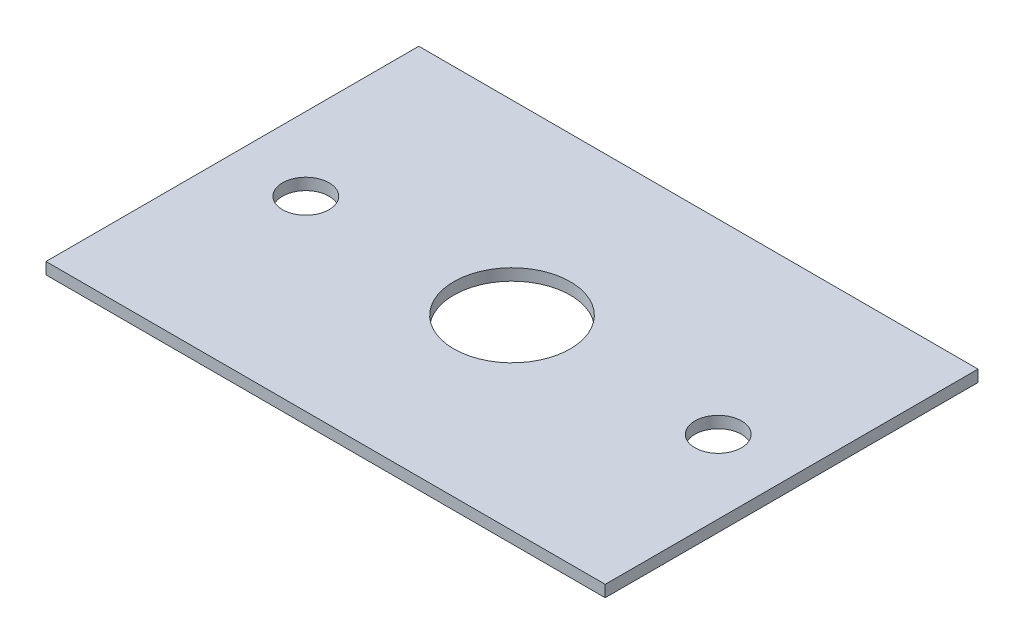
ISO-10303-21;
HEADER;
FILE_DESCRIPTION(('STEP AP214'),'2;1');
FILE_NAME('part.step','',(''),(''),'','','');
FILE_SCHEMA(('AUTOMOTIVE_DESIGN { 1 0 10303 214 1 1 1 1 }'));
ENDSEC;
DATA;
#1=APPLICATION_CONTEXT('core data for automotive mechanical design processes');
#2=APPLICATION_PROTOCOL_DEFINITION('international standard','automotive_design',2000,#1);
#3=PRODUCT_CONTEXT('',#1,'mechanical');
#4=PRODUCT('Part','Part','',(#3));
#5=PRODUCT_RELATED_PRODUCT_CATEGORY('part','',(#4));
#6=PRODUCT_DEFINITION_FORMATION('','',#4);
#7=PRODUCT_DEFINITION_CONTEXT('part definition',#1,'design');
#8=PRODUCT_DEFINITION('design','',#6,#7);
#9=PRODUCT_DEFINITION_SHAPE('','',#8);
#10=(LENGTH_UNIT() NAMED_UNIT(*) SI_UNIT(.MILLI.,.METRE.));
#11=(NAMED_UNIT(*) PLANE_ANGLE_UNIT() SI_UNIT($,.RADIAN.));
#12=(NAMED_UNIT(*) SI_UNIT($,.STERADIAN.) SOLID_ANGLE_UNIT());
#13=UNCERTAINTY_MEASURE_WITH_UNIT(LENGTH_MEASURE(1.E-05),#10,'distance_accuracy_value','');
#14=(GEOMETRIC_REPRESENTATION_CONTEXT(3) GLOBAL_UNCERTAINTY_ASSIGNED_CONTEXT((#13)) GLOBAL_UNIT_ASSIGNED_CONTEXT((#10,
#11,#12)) REPRESENTATION_CONTEXT('',''));
#15=CARTESIAN_POINT('',(0.,0.,0.));
#16=DIRECTION('',(0.,0.,1.));
#17=DIRECTION('',(1.,0.,0.));
#18=AXIS2_PLACEMENT_3D('',#15,#16,#17);
#19=CARTESIAN_POINT('',(0.,1.5875,0.));
#20=DIRECTION('',(0.,1.,0.));
#21=DIRECTION('',(0.,0.,1.));
#22=AXIS2_PLACEMENT_3D('',#19,#20,#21);
#23=PLANE('',#22);
#24=CARTESIAN_POINT('',(-28.1,1.5875,0.));
#25=DIRECTION('',(0.,1.,0.));
#26=DIRECTION('',(0.,0.,1.));
#27=AXIS2_PLACEMENT_3D('',#24,#25,#26);
#28=CIRCLE('',#27,3.175);
#29=CARTESIAN_POINT('',(-28.1,1.5875,3.175));
#30=VERTEX_POINT('',#29);
#31=EDGE_CURVE('E119',#30,#30,#28,.T.);
#32=ORIENTED_EDGE('',*,*,#31,.F.);
#33=EDGE_LOOP('',(#32));
#34=FACE_BOUND('',#33,.T.);
#35=DIRECTION('',(0.,0.,1.));
#36=VECTOR('',#35,1.);
#37=CARTESIAN_POINT('',(-38.1,1.5875,25.4));
#38=LINE('',#37,#36);
#39=CARTESIAN_POINT('',(-38.1,1.5875,-25.4));
#40=VERTEX_POINT('',#39);
#41=CARTESIAN_POINT('',(-38.1,1.5875,25.4));
#42=VERTEX_POINT('',#41);
#43=EDGE_CURVE('E89',#40,#42,#38,.T.);
#44=ORIENTED_EDGE('',*,*,#43,.T.);
#45=DIRECTION('',(1.,0.,0.));
#46=VECTOR('',#45,1.);
#47=CARTESIAN_POINT('',(38.1,1.5875,25.4));
#48=LINE('',#47,#46);
#49=CARTESIAN_POINT('',(38.1,1.5875,25.4));
#50=VERTEX_POINT('',#49);
#51=EDGE_CURVE('E84',#42,#50,#48,.T.);
#52=ORIENTED_EDGE('',*,*,#51,.T.);
#53=DIRECTION('',(0.,0.,-1.));
#54=VECTOR('',#53,1.);
#55=CARTESIAN_POINT('',(38.1,1.5875,25.4));
#56=LINE('',#55,#54);
#57=CARTESIAN_POINT('',(38.1,1.5875,-25.4));
#58=VERTEX_POINT('',#57);
#59=EDGE_CURVE('E87',#50,#58,#56,.T.);
#60=ORIENTED_EDGE('',*,*,#59,.T.);
#61=DIRECTION('',(-1.,0.,0.));
#62=VECTOR('',#61,1.);
#63=CARTESIAN_POINT('',(38.1,1.5875,-25.4));
#64=LINE('',#63,#62);
#65=EDGE_CURVE('E54',#58,#40,#64,.T.);
#66=ORIENTED_EDGE('',*,*,#65,.T.);
#67=EDGE_LOOP('',(#44,#52,#60,#66));
#68=FACE_BOUND('',#67,.T.);
#69=CARTESIAN_POINT('',(0.,1.5875,0.));
#70=DIRECTION('',(0.,1.,0.));
#71=DIRECTION('',(0.,0.,1.));
#72=AXIS2_PLACEMENT_3D('',#69,#70,#71);
#73=CIRCLE('',#72,7.9375);
#74=CARTESIAN_POINT('',(0.,1.5875,7.9375));
#75=VERTEX_POINT('',#74);
#76=EDGE_CURVE('E104',#75,#75,#73,.T.);
#77=ORIENTED_EDGE('',*,*,#76,.F.);
#78=EDGE_LOOP('',(#77));
#79=FACE_BOUND('',#78,.T.);
#80=CARTESIAN_POINT('',(28.1,1.5875,0.));
#81=DIRECTION('',(0.,1.,0.));
#82=DIRECTION('',(0.,0.,1.));
#83=AXIS2_PLACEMENT_3D('',#80,#81,#82);
#84=CIRCLE('',#83,3.17500000000001);
#85=CARTESIAN_POINT('',(28.1,1.5875,3.17500000000001));
#86=VERTEX_POINT('',#85);
#87=EDGE_CURVE('E125',#86,#86,#84,.T.);
#88=ORIENTED_EDGE('',*,*,#87,.F.);
#89=EDGE_LOOP('',(#88));
#90=FACE_BOUND('',#89,.T.);
#91=ADVANCED_FACE('F37',(#34,#68,#79,#90),#23,.T.);
#92=CARTESIAN_POINT('',(0.,0.,0.));
#93=DIRECTION('',(0.,1.,0.));
#94=DIRECTION('',(0.,0.,1.));
#95=AXIS2_PLACEMENT_3D('',#92,#93,#94);
#96=PLANE('',#95);
#97=DIRECTION('',(0.,0.,1.));
#98=VECTOR('',#97,1.);
#99=CARTESIAN_POINT('',(-38.1,0.,25.4));
#100=LINE('',#99,#98);
#101=CARTESIAN_POINT('',(-38.1,0.,-25.4));
#102=VERTEX_POINT('',#101);
#103=CARTESIAN_POINT('',(-38.1,0.,25.4));
#104=VERTEX_POINT('',#103);
#105=EDGE_CURVE('E101',#102,#104,#100,.T.);
#106=ORIENTED_EDGE('',*,*,#105,.F.);
#107=DIRECTION('',(-1.,0.,0.));
#108=VECTOR('',#107,1.);
#109=CARTESIAN_POINT('',(38.1,0.,-25.4));
#110=LINE('',#109,#108);
#111=CARTESIAN_POINT('',(38.1,0.,-25.4));
#112=VERTEX_POINT('',#111);
#113=EDGE_CURVE('E77',#112,#102,#110,.T.);
#114=ORIENTED_EDGE('',*,*,#113,.F.);
#115=DIRECTION('',(0.,0.,-1.));
#116=VECTOR('',#115,1.);
#117=CARTESIAN_POINT('',(38.1,0.,25.4));
#118=LINE('',#117,#116);
#119=CARTESIAN_POINT('',(38.1,0.,25.4));
#120=VERTEX_POINT('',#119);
#121=EDGE_CURVE('E71',#120,#112,#118,.T.);
#122=ORIENTED_EDGE('',*,*,#121,.F.);
#123=DIRECTION('',(1.,0.,0.));
#124=VECTOR('',#123,1.);
#125=CARTESIAN_POINT('',(38.1,0.,25.4));
#126=LINE('',#125,#124);
#127=EDGE_CURVE('E93',#104,#120,#126,.T.);
#128=ORIENTED_EDGE('',*,*,#127,.F.);
#129=EDGE_LOOP('',(#106,#114,#122,#128));
#130=FACE_BOUND('',#129,.T.);
#131=CARTESIAN_POINT('',(0.,0.,0.));
#132=DIRECTION('',(0.,1.,0.));
#133=DIRECTION('',(0.,0.,1.));
#134=AXIS2_PLACEMENT_3D('',#131,#132,#133);
#135=CIRCLE('',#134,7.9375);
#136=CARTESIAN_POINT('',(0.,0.,7.9375));
#137=VERTEX_POINT('',#136);
#138=EDGE_CURVE('E116',#137,#137,#135,.T.);
#139=ORIENTED_EDGE('',*,*,#138,.T.);
#140=EDGE_LOOP('',(#139));
#141=FACE_BOUND('',#140,.T.);
#142=CARTESIAN_POINT('',(-28.1,0.,0.));
#143=DIRECTION('',(0.,1.,0.));
#144=DIRECTION('',(0.,0.,1.));
#145=AXIS2_PLACEMENT_3D('',#142,#143,#144);
#146=CIRCLE('',#145,3.175);
#147=CARTESIAN_POINT('',(-28.1,0.,3.175));
#148=VERTEX_POINT('',#147);
#149=EDGE_CURVE('E122',#148,#148,#146,.T.);
#150=ORIENTED_EDGE('',*,*,#149,.T.);
#151=EDGE_LOOP('',(#150));
#152=FACE_BOUND('',#151,.T.);
#153=CARTESIAN_POINT('',(28.1,0.,0.));
#154=DIRECTION('',(0.,1.,0.));
#155=DIRECTION('',(0.,0.,1.));
#156=AXIS2_PLACEMENT_3D('',#153,#154,#155);
#157=CIRCLE('',#156,3.17500000000001);
#158=CARTESIAN_POINT('',(28.1,0.,3.17500000000001));
#159=VERTEX_POINT('',#158);
#160=EDGE_CURVE('E128',#159,#159,#157,.T.);
#161=ORIENTED_EDGE('',*,*,#160,.T.);
#162=EDGE_LOOP('',(#161));
#163=FACE_BOUND('',#162,.T.);
#164=ADVANCED_FACE('F112',(#130,#141,#152,#163),#96,.F.);
#165=CARTESIAN_POINT('',(-38.1,1.5875,25.4));
#166=DIRECTION('',(1.,0.,0.));
#167=DIRECTION('',(0.,0.,-1.));
#168=AXIS2_PLACEMENT_3D('',#165,#166,#167);
#169=PLANE('',#168);
#170=ORIENTED_EDGE('',*,*,#105,.T.);
#171=DIRECTION('',(0.,-1.,0.));
#172=VECTOR('',#171,1.);
#173=CARTESIAN_POINT('',(-38.1,1.5875,25.4));
#174=LINE('',#173,#172);
#175=EDGE_CURVE('E11',#42,#104,#174,.T.);
#176=ORIENTED_EDGE('',*,*,#175,.F.);
#177=ORIENTED_EDGE('',*,*,#43,.F.);
#178=DIRECTION('',(0.,-1.,0.));
#179=VECTOR('',#178,1.);
#180=CARTESIAN_POINT('',(-38.1,1.5875,-25.4));
#181=LINE('',#180,#179);
#182=EDGE_CURVE('E97',#40,#102,#181,.T.);
#183=ORIENTED_EDGE('',*,*,#182,.T.);
#184=EDGE_LOOP('',(#170,#176,#177,#183));
#185=FACE_BOUND('',#184,.T.);
#186=ADVANCED_FACE('F39',(#185),#169,.F.);
#187=CARTESIAN_POINT('',(38.1,1.5875,25.4));
#188=DIRECTION('',(0.,0.,-1.));
#189=DIRECTION('',(-1.,0.,0.));
#190=AXIS2_PLACEMENT_3D('',#187,#188,#189);
#191=PLANE('',#190);
#192=ORIENTED_EDGE('',*,*,#127,.T.);
#193=DIRECTION('',(0.,-1.,0.));
#194=VECTOR('',#193,1.);
#195=CARTESIAN_POINT('',(38.1,1.5875,25.4));
#196=LINE('',#195,#194);
#197=EDGE_CURVE('E46',#50,#120,#196,.T.);
#198=ORIENTED_EDGE('',*,*,#197,.F.);
#199=ORIENTED_EDGE('',*,*,#51,.F.);
#200=ORIENTED_EDGE('',*,*,#175,.T.);
#201=EDGE_LOOP('',(#192,#198,#199,#200));
#202=FACE_BOUND('',#201,.T.);
#203=ADVANCED_FACE('F92',(#202),#191,.F.);
#204=CARTESIAN_POINT('',(38.1,1.5875,25.4));
#205=DIRECTION('',(-1.,0.,0.));
#206=DIRECTION('',(0.,0.,1.));
#207=AXIS2_PLACEMENT_3D('',#204,#205,#206);
#208=PLANE('',#207);
#209=ORIENTED_EDGE('',*,*,#121,.T.);
#210=DIRECTION('',(0.,-1.,0.));
#211=VECTOR('',#210,1.);
#212=CARTESIAN_POINT('',(38.1,1.5875,-25.4));
#213=LINE('',#212,#211);
#214=EDGE_CURVE('E94',#58,#112,#213,.T.);
#215=ORIENTED_EDGE('',*,*,#214,.F.);
#216=ORIENTED_EDGE('',*,*,#59,.F.);
#217=ORIENTED_EDGE('',*,*,#197,.T.);
#218=EDGE_LOOP('',(#209,#215,#216,#217));
#219=FACE_BOUND('',#218,.T.);
#220=ADVANCED_FACE('F95',(#219),#208,.F.);
#221=CARTESIAN_POINT('',(38.1,1.5875,-25.4));
#222=DIRECTION('',(0.,0.,1.));
#223=DIRECTION('',(1.,0.,0.));
#224=AXIS2_PLACEMENT_3D('',#221,#222,#223);
#225=PLANE('',#224);
#226=ORIENTED_EDGE('',*,*,#113,.T.);
#227=ORIENTED_EDGE('',*,*,#182,.F.);
#228=ORIENTED_EDGE('',*,*,#65,.F.);
#229=ORIENTED_EDGE('',*,*,#214,.T.);
#230=EDGE_LOOP('',(#226,#227,#228,#229));
#231=FACE_BOUND('',#230,.T.);
#232=ADVANCED_FACE('F109',(#231),#225,.F.);
#233=CARTESIAN_POINT('',(0.,1.5875,0.));
#234=DIRECTION('',(0.,-1.,0.));
#235=DIRECTION('',(0.,0.,-1.));
#236=AXIS2_PLACEMENT_3D('',#233,#234,#235);
#237=CYLINDRICAL_SURFACE('',#236,7.9375);
#238=ORIENTED_EDGE('',*,*,#76,.T.);
#239=EDGE_LOOP('',(#238));
#240=FACE_BOUND('',#239,.T.);
#241=ORIENTED_EDGE('',*,*,#138,.F.);
#242=EDGE_LOOP('',(#241));
#243=FACE_BOUND('',#242,.T.);
#244=ADVANCED_FACE('F146',(#240,#243),#237,.F.);
#245=CARTESIAN_POINT('',(-28.1,1.5875,0.));
#246=DIRECTION('',(0.,-1.,0.));
#247=DIRECTION('',(0.,0.,-1.));
#248=AXIS2_PLACEMENT_3D('',#245,#246,#247);
#249=CYLINDRICAL_SURFACE('',#248,3.175);
#250=ORIENTED_EDGE('',*,*,#31,.T.);
#251=EDGE_LOOP('',(#250));
#252=FACE_BOUND('',#251,.T.);
#253=ORIENTED_EDGE('',*,*,#149,.F.);
#254=EDGE_LOOP('',(#253));
#255=FACE_BOUND('',#254,.T.);
#256=ADVANCED_FACE('F200',(#252,#255),#249,.F.);
#257=CARTESIAN_POINT('',(28.1,1.5875,0.));
#258=DIRECTION('',(0.,-1.,0.));
#259=DIRECTION('',(0.,0.,-1.));
#260=AXIS2_PLACEMENT_3D('',#257,#258,#259);
#261=CYLINDRICAL_SURFACE('',#260,3.17500000000001);
#262=ORIENTED_EDGE('',*,*,#87,.T.);
#263=EDGE_LOOP('',(#262));
#264=FACE_BOUND('',#263,.T.);
#265=ORIENTED_EDGE('',*,*,#160,.F.);
#266=EDGE_LOOP('',(#265));
#267=FACE_BOUND('',#266,.T.);
#268=ADVANCED_FACE('F134',(#264,#267),#261,.F.);
#269=CLOSED_SHELL('',(#91,#164,#186,#203,#220,#232,#244,#256,#268));
#270=MANIFOLD_SOLID_BREP('B2',#269);
#271=ADVANCED_BREP_SHAPE_REPRESENTATION('',(#18,#270),#14);
#272=SHAPE_DEFINITION_REPRESENTATION(#9,#271);
ENDSEC;
END-ISO-10303-21;
